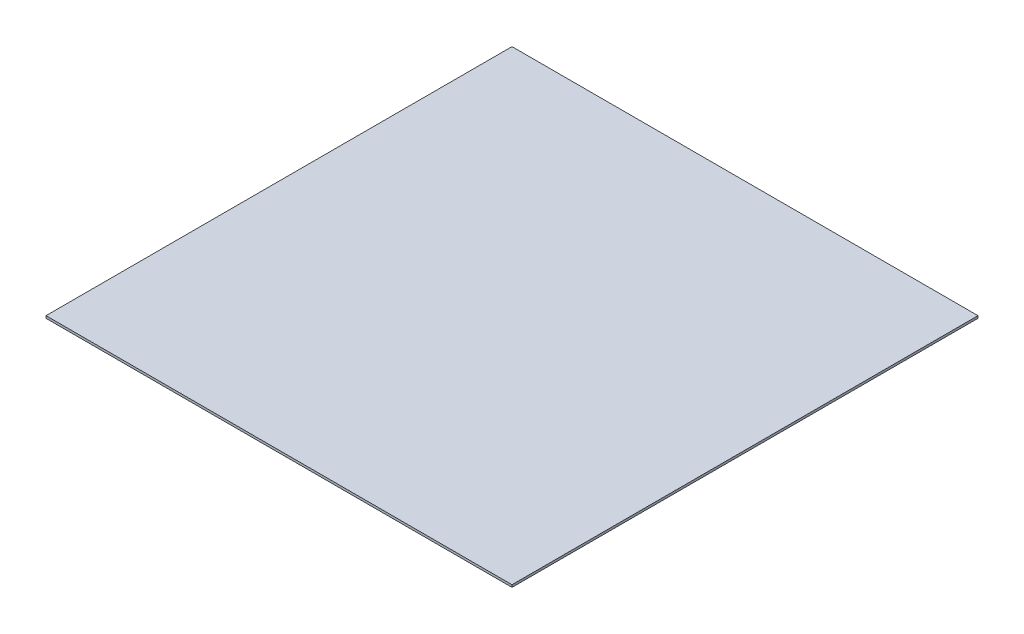
ISO-10303-21;
HEADER;
FILE_DESCRIPTION(('STEP AP214'),'2;1');
FILE_NAME('part.step','',(''),(''),'','','');
FILE_SCHEMA(('AUTOMOTIVE_DESIGN { 1 0 10303 214 1 1 1 1 }'));
ENDSEC;
DATA;
#1=APPLICATION_CONTEXT('core data for automotive mechanical design processes');
#2=APPLICATION_PROTOCOL_DEFINITION('international standard','automotive_design',2000,#1);
#3=PRODUCT_CONTEXT('',#1,'mechanical');
#4=PRODUCT('Part','Part','',(#3));
#5=PRODUCT_RELATED_PRODUCT_CATEGORY('part','',(#4));
#6=PRODUCT_DEFINITION_FORMATION('','',#4);
#7=PRODUCT_DEFINITION_CONTEXT('part definition',#1,'design');
#8=PRODUCT_DEFINITION('design','',#6,#7);
#9=PRODUCT_DEFINITION_SHAPE('','',#8);
#10=(LENGTH_UNIT() NAMED_UNIT(*) SI_UNIT(.MILLI.,.METRE.));
#11=(NAMED_UNIT(*) PLANE_ANGLE_UNIT() SI_UNIT($,.RADIAN.));
#12=(NAMED_UNIT(*) SI_UNIT($,.STERADIAN.) SOLID_ANGLE_UNIT());
#13=UNCERTAINTY_MEASURE_WITH_UNIT(LENGTH_MEASURE(1.E-05),#10,'distance_accuracy_value','');
#14=(GEOMETRIC_REPRESENTATION_CONTEXT(3) GLOBAL_UNCERTAINTY_ASSIGNED_CONTEXT((#13)) GLOBAL_UNIT_ASSIGNED_CONTEXT((#10,
#11,#12)) REPRESENTATION_CONTEXT('',''));
#15=CARTESIAN_POINT('',(0.,0.,0.));
#16=DIRECTION('',(0.,0.,1.));
#17=DIRECTION('',(1.,0.,0.));
#18=AXIS2_PLACEMENT_3D('',#15,#16,#17);
#19=CARTESIAN_POINT('',(-500.,2.5,500.));
#20=DIRECTION('',(-1.,0.,0.));
#21=DIRECTION('',(0.,0.,1.));
#22=AXIS2_PLACEMENT_3D('',#19,#20,#21);
#23=PLANE('',#22);
#24=DIRECTION('',(0.,0.,-1.));
#25=VECTOR('',#24,1.);
#26=CARTESIAN_POINT('',(-500.,-2.5,500.));
#27=LINE('',#26,#25);
#28=CARTESIAN_POINT('',(-500.,-2.5,500.));
#29=VERTEX_POINT('',#28);
#30=CARTESIAN_POINT('',(-500.,-2.5,-500.));
#31=VERTEX_POINT('',#30);
#32=EDGE_CURVE('E99',#29,#31,#27,.T.);
#33=ORIENTED_EDGE('',*,*,#32,.F.);
#34=DIRECTION('',(0.,-1.,0.));
#35=VECTOR('',#34,1.);
#36=CARTESIAN_POINT('',(-500.,2.5,500.));
#37=LINE('',#36,#35);
#38=CARTESIAN_POINT('',(-500.,2.5,500.));
#39=VERTEX_POINT('',#38);
#40=EDGE_CURVE('E11',#39,#29,#37,.T.);
#41=ORIENTED_EDGE('',*,*,#40,.F.);
#42=DIRECTION('',(0.,0.,-1.));
#43=VECTOR('',#42,1.);
#44=CARTESIAN_POINT('',(-500.,2.5,500.));
#45=LINE('',#44,#43);
#46=CARTESIAN_POINT('',(-500.,2.5,-500.));
#47=VERTEX_POINT('',#46);
#48=EDGE_CURVE('E94',#39,#47,#45,.T.);
#49=ORIENTED_EDGE('',*,*,#48,.T.);
#50=DIRECTION('',(0.,-1.,0.));
#51=VECTOR('',#50,1.);
#52=CARTESIAN_POINT('',(-500.,2.5,-500.));
#53=LINE('',#52,#51);
#54=EDGE_CURVE('E37',#47,#31,#53,.T.);
#55=ORIENTED_EDGE('',*,*,#54,.T.);
#56=EDGE_LOOP('',(#33,#41,#49,#55));
#57=FACE_BOUND('',#56,.T.);
#58=ADVANCED_FACE('F34',(#57),#23,.T.);
#59=CARTESIAN_POINT('',(-500.,2.5,500.));
#60=DIRECTION('',(0.,0.,-1.));
#61=DIRECTION('',(-1.,0.,0.));
#62=AXIS2_PLACEMENT_3D('',#59,#60,#61);
#63=PLANE('',#62);
#64=DIRECTION('',(1.,0.,0.));
#65=VECTOR('',#64,1.);
#66=CARTESIAN_POINT('',(-500.,-2.5,500.));
#67=LINE('',#66,#65);
#68=CARTESIAN_POINT('',(500.,-2.5,500.));
#69=VERTEX_POINT('',#68);
#70=EDGE_CURVE('E67',#29,#69,#67,.T.);
#71=ORIENTED_EDGE('',*,*,#70,.T.);
#72=DIRECTION('',(0.,-1.,0.));
#73=VECTOR('',#72,1.);
#74=CARTESIAN_POINT('',(500.,2.5,500.));
#75=LINE('',#74,#73);
#76=CARTESIAN_POINT('',(500.,2.5,500.));
#77=VERTEX_POINT('',#76);
#78=EDGE_CURVE('E43',#77,#69,#75,.T.);
#79=ORIENTED_EDGE('',*,*,#78,.F.);
#80=DIRECTION('',(1.,0.,0.));
#81=VECTOR('',#80,1.);
#82=CARTESIAN_POINT('',(-500.,2.5,500.));
#83=LINE('',#82,#81);
#84=EDGE_CURVE('E84',#39,#77,#83,.T.);
#85=ORIENTED_EDGE('',*,*,#84,.F.);
#86=ORIENTED_EDGE('',*,*,#40,.T.);
#87=EDGE_LOOP('',(#71,#79,#85,#86));
#88=FACE_BOUND('',#87,.T.);
#89=ADVANCED_FACE('F109',(#88),#63,.F.);
#90=CARTESIAN_POINT('',(500.,2.5,500.));
#91=DIRECTION('',(-1.,0.,0.));
#92=DIRECTION('',(0.,0.,1.));
#93=AXIS2_PLACEMENT_3D('',#90,#91,#92);
#94=PLANE('',#93);
#95=DIRECTION('',(0.,0.,-1.));
#96=VECTOR('',#95,1.);
#97=CARTESIAN_POINT('',(500.,-2.5,500.));
#98=LINE('',#97,#96);
#99=CARTESIAN_POINT('',(500.,-2.5,-500.));
#100=VERTEX_POINT('',#99);
#101=EDGE_CURVE('E91',#69,#100,#98,.T.);
#102=ORIENTED_EDGE('',*,*,#101,.T.);
#103=DIRECTION('',(0.,-1.,0.));
#104=VECTOR('',#103,1.);
#105=CARTESIAN_POINT('',(500.,2.5,-500.));
#106=LINE('',#105,#104);
#107=CARTESIAN_POINT('',(500.,2.5,-500.));
#108=VERTEX_POINT('',#107);
#109=EDGE_CURVE('E88',#108,#100,#106,.T.);
#110=ORIENTED_EDGE('',*,*,#109,.F.);
#111=DIRECTION('',(0.,0.,-1.));
#112=VECTOR('',#111,1.);
#113=CARTESIAN_POINT('',(500.,2.5,500.));
#114=LINE('',#113,#112);
#115=EDGE_CURVE('E79',#77,#108,#114,.T.);
#116=ORIENTED_EDGE('',*,*,#115,.F.);
#117=ORIENTED_EDGE('',*,*,#78,.T.);
#118=EDGE_LOOP('',(#102,#110,#116,#117));
#119=FACE_BOUND('',#118,.T.);
#120=ADVANCED_FACE('F89',(#119),#94,.F.);
#121=CARTESIAN_POINT('',(-500.,2.5,-500.));
#122=DIRECTION('',(0.,0.,-1.));
#123=DIRECTION('',(-1.,0.,0.));
#124=AXIS2_PLACEMENT_3D('',#121,#122,#123);
#125=PLANE('',#124);
#126=DIRECTION('',(1.,0.,0.));
#127=VECTOR('',#126,1.);
#128=CARTESIAN_POINT('',(-500.,-2.5,-500.));
#129=LINE('',#128,#127);
#130=EDGE_CURVE('E102',#31,#100,#129,.T.);
#131=ORIENTED_EDGE('',*,*,#130,.F.);
#132=ORIENTED_EDGE('',*,*,#54,.F.);
#133=DIRECTION('',(1.,0.,0.));
#134=VECTOR('',#133,1.);
#135=CARTESIAN_POINT('',(-500.,2.5,-500.));
#136=LINE('',#135,#134);
#137=EDGE_CURVE('E83',#47,#108,#136,.T.);
#138=ORIENTED_EDGE('',*,*,#137,.T.);
#139=ORIENTED_EDGE('',*,*,#109,.T.);
#140=EDGE_LOOP('',(#131,#132,#138,#139));
#141=FACE_BOUND('',#140,.T.);
#142=ADVANCED_FACE('F93',(#141),#125,.T.);
#143=CARTESIAN_POINT('',(0.,2.5,0.));
#144=DIRECTION('',(0.,-1.,0.));
#145=DIRECTION('',(0.,0.,-1.));
#146=AXIS2_PLACEMENT_3D('',#143,#144,#145);
#147=PLANE('',#146);
#148=ORIENTED_EDGE('',*,*,#48,.F.);
#149=ORIENTED_EDGE('',*,*,#84,.T.);
#150=ORIENTED_EDGE('',*,*,#115,.T.);
#151=ORIENTED_EDGE('',*,*,#137,.F.);
#152=EDGE_LOOP('',(#148,#149,#150,#151));
#153=FACE_BOUND('',#152,.T.);
#154=ADVANCED_FACE('F82',(#153),#147,.F.);
#155=CARTESIAN_POINT('',(0.,-2.5,0.));
#156=DIRECTION('',(0.,-1.,0.));
#157=DIRECTION('',(0.,0.,-1.));
#158=AXIS2_PLACEMENT_3D('',#155,#156,#157);
#159=PLANE('',#158);
#160=ORIENTED_EDGE('',*,*,#32,.T.);
#161=ORIENTED_EDGE('',*,*,#130,.T.);
#162=ORIENTED_EDGE('',*,*,#101,.F.);
#163=ORIENTED_EDGE('',*,*,#70,.F.);
#164=EDGE_LOOP('',(#160,#161,#162,#163));
#165=FACE_BOUND('',#164,.T.);
#166=ADVANCED_FACE('F107',(#165),#159,.T.);
#167=CLOSED_SHELL('',(#58,#89,#120,#142,#154,#166));
#168=MANIFOLD_SOLID_BREP('B2',#167);
#169=ADVANCED_BREP_SHAPE_REPRESENTATION('',(#18,#168),#14);
#170=SHAPE_DEFINITION_REPRESENTATION(#9,#169);
ENDSEC;
END-ISO-10303-21;
